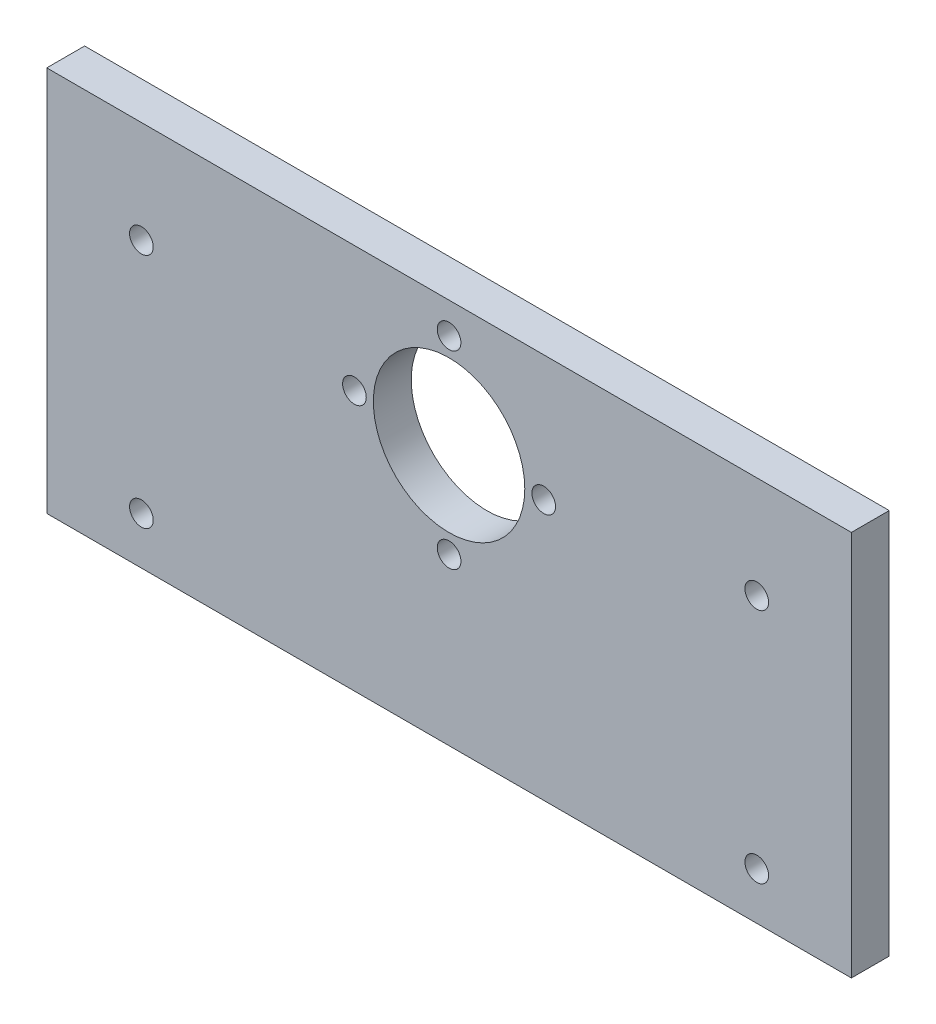
ISO-10303-21;
HEADER;
FILE_DESCRIPTION(('STEP AP214'),'2;1');
FILE_NAME('part.step','',(''),(''),'','','');
FILE_SCHEMA(('AUTOMOTIVE_DESIGN { 1 0 10303 214 1 1 1 1 }'));
ENDSEC;
DATA;
#1=APPLICATION_CONTEXT('core data for automotive mechanical design processes');
#2=APPLICATION_PROTOCOL_DEFINITION('international standard','automotive_design',2000,#1);
#3=PRODUCT_CONTEXT('',#1,'mechanical');
#4=PRODUCT('Part','Part','',(#3));
#5=PRODUCT_RELATED_PRODUCT_CATEGORY('part','',(#4));
#6=PRODUCT_DEFINITION_FORMATION('','',#4);
#7=PRODUCT_DEFINITION_CONTEXT('part definition',#1,'design');
#8=PRODUCT_DEFINITION('design','',#6,#7);
#9=PRODUCT_DEFINITION_SHAPE('','',#8);
#10=(LENGTH_UNIT() NAMED_UNIT(*) SI_UNIT(.MILLI.,.METRE.));
#11=(NAMED_UNIT(*) PLANE_ANGLE_UNIT() SI_UNIT($,.RADIAN.));
#12=(NAMED_UNIT(*) SI_UNIT($,.STERADIAN.) SOLID_ANGLE_UNIT());
#13=UNCERTAINTY_MEASURE_WITH_UNIT(LENGTH_MEASURE(1.E-05),#10,'distance_accuracy_value','');
#14=(GEOMETRIC_REPRESENTATION_CONTEXT(3) GLOBAL_UNCERTAINTY_ASSIGNED_CONTEXT((#13)) GLOBAL_UNIT_ASSIGNED_CONTEXT((#10,
#11,#12)) REPRESENTATION_CONTEXT('',''));
#15=CARTESIAN_POINT('',(0.,0.,0.));
#16=DIRECTION('',(0.,0.,1.));
#17=DIRECTION('',(1.,0.,0.));
#18=AXIS2_PLACEMENT_3D('',#15,#16,#17);
#19=CARTESIAN_POINT('',(85.0178327669924,83.3071932635603,8.));
#20=DIRECTION('',(0.,0.,-1.));
#21=DIRECTION('',(-1.,0.,0.));
#22=AXIS2_PLACEMENT_3D('',#19,#20,#21);
#23=PLANE('',#22);
#24=CARTESIAN_POINT('',(20.,0.,8.));
#25=DIRECTION('',(0.,0.,1.));
#26=DIRECTION('',(1.,0.,0.));
#27=AXIS2_PLACEMENT_3D('',#24,#25,#26);
#28=CIRCLE('',#27,2.5);
#29=CARTESIAN_POINT('',(22.5,0.,8.));
#30=VERTEX_POINT('',#29);
#31=EDGE_CURVE('E151',#30,#30,#28,.T.);
#32=ORIENTED_EDGE('',*,*,#31,.F.);
#33=EDGE_LOOP('',(#32));
#34=FACE_BOUND('',#33,.T.);
#35=CARTESIAN_POINT('',(0.,-20.,8.));
#36=DIRECTION('',(0.,0.,1.));
#37=DIRECTION('',(1.,0.,0.));
#38=AXIS2_PLACEMENT_3D('',#35,#36,#37);
#39=CIRCLE('',#38,2.5);
#40=CARTESIAN_POINT('',(2.49999999999998,-20.,8.));
#41=VERTEX_POINT('',#40);
#42=EDGE_CURVE('E145',#41,#41,#39,.T.);
#43=ORIENTED_EDGE('',*,*,#42,.F.);
#44=EDGE_LOOP('',(#43));
#45=FACE_BOUND('',#44,.T.);
#46=CARTESIAN_POINT('',(-20.,0.,8.));
#47=DIRECTION('',(0.,0.,1.));
#48=DIRECTION('',(1.,0.,0.));
#49=AXIS2_PLACEMENT_3D('',#46,#47,#48);
#50=CIRCLE('',#49,2.5);
#51=CARTESIAN_POINT('',(-17.5,0.,8.));
#52=VERTEX_POINT('',#51);
#53=EDGE_CURVE('E139',#52,#52,#50,.T.);
#54=ORIENTED_EDGE('',*,*,#53,.F.);
#55=EDGE_LOOP('',(#54));
#56=FACE_BOUND('',#55,.T.);
#57=CARTESIAN_POINT('',(0.,20.,8.));
#58=DIRECTION('',(0.,0.,1.));
#59=DIRECTION('',(1.,0.,0.));
#60=AXIS2_PLACEMENT_3D('',#57,#58,#59);
#61=CIRCLE('',#60,2.5);
#62=CARTESIAN_POINT('',(2.49999999999998,20.,8.));
#63=VERTEX_POINT('',#62);
#64=EDGE_CURVE('E133',#63,#63,#61,.T.);
#65=ORIENTED_EDGE('',*,*,#64,.F.);
#66=EDGE_LOOP('',(#65));
#67=FACE_BOUND('',#66,.T.);
#68=CARTESIAN_POINT('',(65.0178327669924,-45.,8.));
#69=DIRECTION('',(0.,0.,1.));
#70=DIRECTION('',(1.,0.,0.));
#71=AXIS2_PLACEMENT_3D('',#68,#69,#70);
#72=CIRCLE('',#71,2.5);
#73=CARTESIAN_POINT('',(67.5178327669924,-45.,8.));
#74=VERTEX_POINT('',#73);
#75=EDGE_CURVE('E127',#74,#74,#72,.T.);
#76=ORIENTED_EDGE('',*,*,#75,.F.);
#77=EDGE_LOOP('',(#76));
#78=FACE_BOUND('',#77,.T.);
#79=CARTESIAN_POINT('',(65.0178327669924,5.00000000000001,8.));
#80=DIRECTION('',(0.,0.,1.));
#81=DIRECTION('',(1.,0.,0.));
#82=AXIS2_PLACEMENT_3D('',#79,#80,#81);
#83=CIRCLE('',#82,2.5);
#84=CARTESIAN_POINT('',(67.5178327669924,5.00000000000001,8.));
#85=VERTEX_POINT('',#84);
#86=EDGE_CURVE('E121',#85,#85,#83,.T.);
#87=ORIENTED_EDGE('',*,*,#86,.F.);
#88=EDGE_LOOP('',(#87));
#89=FACE_BOUND('',#88,.T.);
#90=CARTESIAN_POINT('',(-65.0178327669924,-45.,8.));
#91=DIRECTION('',(0.,0.,1.));
#92=DIRECTION('',(1.,0.,0.));
#93=AXIS2_PLACEMENT_3D('',#90,#91,#92);
#94=CIRCLE('',#93,2.5);
#95=CARTESIAN_POINT('',(-62.5178327669924,-45.,8.));
#96=VERTEX_POINT('',#95);
#97=EDGE_CURVE('E115',#96,#96,#94,.T.);
#98=ORIENTED_EDGE('',*,*,#97,.F.);
#99=EDGE_LOOP('',(#98));
#100=FACE_BOUND('',#99,.T.);
#101=CARTESIAN_POINT('',(-65.0178327669924,4.99999999999999,8.));
#102=DIRECTION('',(0.,0.,1.));
#103=DIRECTION('',(1.,0.,0.));
#104=AXIS2_PLACEMENT_3D('',#101,#102,#103);
#105=CIRCLE('',#104,2.5);
#106=CARTESIAN_POINT('',(-62.5178327669924,4.99999999999999,8.));
#107=VERTEX_POINT('',#106);
#108=EDGE_CURVE('E109',#107,#107,#105,.T.);
#109=ORIENTED_EDGE('',*,*,#108,.F.);
#110=EDGE_LOOP('',(#109));
#111=FACE_BOUND('',#110,.T.);
#112=DIRECTION('',(0.,-1.,0.));
#113=VECTOR('',#112,1.);
#114=CARTESIAN_POINT('',(-85.0178327669924,-83.3071932635603,8.));
#115=LINE('',#114,#113);
#116=CARTESIAN_POINT('',(-85.0178327669924,26.5477243647325,8.));
#117=VERTEX_POINT('',#116);
#118=CARTESIAN_POINT('',(-85.0178327669924,-55.,8.));
#119=VERTEX_POINT('',#118);
#120=EDGE_CURVE('E11',#117,#119,#115,.T.);
#121=ORIENTED_EDGE('',*,*,#120,.T.);
#122=DIRECTION('',(-1.,0.,0.));
#123=VECTOR('',#122,1.);
#124=CARTESIAN_POINT('',(-85.0178327669924,-55.,8.));
#125=LINE('',#124,#123);
#126=CARTESIAN_POINT('',(85.0178327669924,-55.,8.));
#127=VERTEX_POINT('',#126);
#128=EDGE_CURVE('E48',#127,#119,#125,.T.);
#129=ORIENTED_EDGE('',*,*,#128,.F.);
#130=DIRECTION('',(0.,1.,0.));
#131=VECTOR('',#130,1.);
#132=CARTESIAN_POINT('',(85.0178327669924,-83.3071932635603,8.));
#133=LINE('',#132,#131);
#134=CARTESIAN_POINT('',(85.0178327669924,26.5477243647325,8.));
#135=VERTEX_POINT('',#134);
#136=EDGE_CURVE('E40',#127,#135,#133,.T.);
#137=ORIENTED_EDGE('',*,*,#136,.T.);
#138=DIRECTION('',(1.,0.,0.));
#139=VECTOR('',#138,1.);
#140=CARTESIAN_POINT('',(-85.0178327669924,26.5477243647325,8.));
#141=LINE('',#140,#139);
#142=EDGE_CURVE('E102',#117,#135,#141,.T.);
#143=ORIENTED_EDGE('',*,*,#142,.F.);
#144=EDGE_LOOP('',(#121,#129,#137,#143));
#145=FACE_BOUND('',#144,.T.);
#146=CARTESIAN_POINT('',(0.,0.,8.));
#147=DIRECTION('',(0.,0.,1.));
#148=DIRECTION('',(1.,0.,0.));
#149=AXIS2_PLACEMENT_3D('',#146,#147,#148);
#150=CIRCLE('',#149,16.);
#151=CARTESIAN_POINT('',(16.,0.,8.));
#152=VERTEX_POINT('',#151);
#153=EDGE_CURVE('E90',#152,#152,#150,.T.);
#154=ORIENTED_EDGE('',*,*,#153,.F.);
#155=EDGE_LOOP('',(#154));
#156=FACE_BOUND('',#155,.T.);
#157=ADVANCED_FACE('F31',(#34,#45,#56,#67,#78,#89,#100,#111,#145,#156),#23,.F.);
#158=CARTESIAN_POINT('',(85.0178327669924,83.3071932635603,0.));
#159=DIRECTION('',(0.,0.,-1.));
#160=DIRECTION('',(-1.,0.,0.));
#161=AXIS2_PLACEMENT_3D('',#158,#159,#160);
#162=PLANE('',#161);
#163=CARTESIAN_POINT('',(20.,0.,0.));
#164=DIRECTION('',(0.,0.,1.));
#165=DIRECTION('',(1.,0.,0.));
#166=AXIS2_PLACEMENT_3D('',#163,#164,#165);
#167=CIRCLE('',#166,2.5);
#168=CARTESIAN_POINT('',(22.5,0.,0.));
#169=VERTEX_POINT('',#168);
#170=EDGE_CURVE('E148',#169,#169,#167,.T.);
#171=ORIENTED_EDGE('',*,*,#170,.T.);
#172=EDGE_LOOP('',(#171));
#173=FACE_BOUND('',#172,.T.);
#174=CARTESIAN_POINT('',(0.,-20.,0.));
#175=DIRECTION('',(0.,0.,1.));
#176=DIRECTION('',(1.,0.,0.));
#177=AXIS2_PLACEMENT_3D('',#174,#175,#176);
#178=CIRCLE('',#177,2.5);
#179=CARTESIAN_POINT('',(2.49999999999998,-20.,0.));
#180=VERTEX_POINT('',#179);
#181=EDGE_CURVE('E142',#180,#180,#178,.T.);
#182=ORIENTED_EDGE('',*,*,#181,.T.);
#183=EDGE_LOOP('',(#182));
#184=FACE_BOUND('',#183,.T.);
#185=CARTESIAN_POINT('',(-20.,0.,0.));
#186=DIRECTION('',(0.,0.,1.));
#187=DIRECTION('',(1.,0.,0.));
#188=AXIS2_PLACEMENT_3D('',#185,#186,#187);
#189=CIRCLE('',#188,2.5);
#190=CARTESIAN_POINT('',(-17.5,0.,0.));
#191=VERTEX_POINT('',#190);
#192=EDGE_CURVE('E136',#191,#191,#189,.T.);
#193=ORIENTED_EDGE('',*,*,#192,.T.);
#194=EDGE_LOOP('',(#193));
#195=FACE_BOUND('',#194,.T.);
#196=CARTESIAN_POINT('',(0.,20.,0.));
#197=DIRECTION('',(0.,0.,1.));
#198=DIRECTION('',(1.,0.,0.));
#199=AXIS2_PLACEMENT_3D('',#196,#197,#198);
#200=CIRCLE('',#199,2.5);
#201=CARTESIAN_POINT('',(2.49999999999998,20.,0.));
#202=VERTEX_POINT('',#201);
#203=EDGE_CURVE('E130',#202,#202,#200,.T.);
#204=ORIENTED_EDGE('',*,*,#203,.T.);
#205=EDGE_LOOP('',(#204));
#206=FACE_BOUND('',#205,.T.);
#207=CARTESIAN_POINT('',(65.0178327669924,-45.,0.));
#208=DIRECTION('',(0.,0.,1.));
#209=DIRECTION('',(1.,0.,0.));
#210=AXIS2_PLACEMENT_3D('',#207,#208,#209);
#211=CIRCLE('',#210,2.5);
#212=CARTESIAN_POINT('',(67.5178327669924,-45.,0.));
#213=VERTEX_POINT('',#212);
#214=EDGE_CURVE('E124',#213,#213,#211,.T.);
#215=ORIENTED_EDGE('',*,*,#214,.T.);
#216=EDGE_LOOP('',(#215));
#217=FACE_BOUND('',#216,.T.);
#218=CARTESIAN_POINT('',(65.0178327669924,5.00000000000001,0.));
#219=DIRECTION('',(0.,0.,1.));
#220=DIRECTION('',(1.,0.,0.));
#221=AXIS2_PLACEMENT_3D('',#218,#219,#220);
#222=CIRCLE('',#221,2.5);
#223=CARTESIAN_POINT('',(67.5178327669924,5.00000000000001,0.));
#224=VERTEX_POINT('',#223);
#225=EDGE_CURVE('E118',#224,#224,#222,.T.);
#226=ORIENTED_EDGE('',*,*,#225,.T.);
#227=EDGE_LOOP('',(#226));
#228=FACE_BOUND('',#227,.T.);
#229=CARTESIAN_POINT('',(-65.0178327669924,-45.,0.));
#230=DIRECTION('',(0.,0.,1.));
#231=DIRECTION('',(1.,0.,0.));
#232=AXIS2_PLACEMENT_3D('',#229,#230,#231);
#233=CIRCLE('',#232,2.5);
#234=CARTESIAN_POINT('',(-62.5178327669924,-45.,0.));
#235=VERTEX_POINT('',#234);
#236=EDGE_CURVE('E112',#235,#235,#233,.T.);
#237=ORIENTED_EDGE('',*,*,#236,.T.);
#238=EDGE_LOOP('',(#237));
#239=FACE_BOUND('',#238,.T.);
#240=CARTESIAN_POINT('',(-65.0178327669924,4.99999999999999,0.));
#241=DIRECTION('',(0.,0.,1.));
#242=DIRECTION('',(1.,0.,0.));
#243=AXIS2_PLACEMENT_3D('',#240,#241,#242);
#244=CIRCLE('',#243,2.5);
#245=CARTESIAN_POINT('',(-62.5178327669924,4.99999999999999,0.));
#246=VERTEX_POINT('',#245);
#247=EDGE_CURVE('E107',#246,#246,#244,.T.);
#248=ORIENTED_EDGE('',*,*,#247,.T.);
#249=EDGE_LOOP('',(#248));
#250=FACE_BOUND('',#249,.T.);
#251=DIRECTION('',(-1.,0.,0.));
#252=VECTOR('',#251,1.);
#253=CARTESIAN_POINT('',(-85.0178327669924,-55.,0.));
#254=LINE('',#253,#252);
#255=CARTESIAN_POINT('',(85.0178327669924,-55.,0.));
#256=VERTEX_POINT('',#255);
#257=CARTESIAN_POINT('',(-85.0178327669924,-55.,0.));
#258=VERTEX_POINT('',#257);
#259=EDGE_CURVE('E73',#256,#258,#254,.T.);
#260=ORIENTED_EDGE('',*,*,#259,.T.);
#261=DIRECTION('',(0.,-1.,0.));
#262=VECTOR('',#261,1.);
#263=CARTESIAN_POINT('',(-85.0178327669924,-83.3071932635603,0.));
#264=LINE('',#263,#262);
#265=CARTESIAN_POINT('',(-85.0178327669924,26.5477243647325,0.));
#266=VERTEX_POINT('',#265);
#267=EDGE_CURVE('E35',#266,#258,#264,.T.);
#268=ORIENTED_EDGE('',*,*,#267,.F.);
#269=DIRECTION('',(1.,0.,0.));
#270=VECTOR('',#269,1.);
#271=CARTESIAN_POINT('',(-85.0178327669924,26.5477243647325,0.));
#272=LINE('',#271,#270);
#273=CARTESIAN_POINT('',(85.0178327669924,26.5477243647325,0.));
#274=VERTEX_POINT('',#273);
#275=EDGE_CURVE('E56',#266,#274,#272,.T.);
#276=ORIENTED_EDGE('',*,*,#275,.T.);
#277=DIRECTION('',(0.,1.,0.));
#278=VECTOR('',#277,1.);
#279=CARTESIAN_POINT('',(85.0178327669924,-83.3071932635603,0.));
#280=LINE('',#279,#278);
#281=EDGE_CURVE('E86',#256,#274,#280,.T.);
#282=ORIENTED_EDGE('',*,*,#281,.F.);
#283=EDGE_LOOP('',(#260,#268,#276,#282));
#284=FACE_BOUND('',#283,.T.);
#285=CARTESIAN_POINT('',(0.,0.,0.));
#286=DIRECTION('',(0.,0.,1.));
#287=DIRECTION('',(1.,0.,0.));
#288=AXIS2_PLACEMENT_3D('',#285,#286,#287);
#289=CIRCLE('',#288,16.);
#290=CARTESIAN_POINT('',(16.,0.,0.));
#291=VERTEX_POINT('',#290);
#292=EDGE_CURVE('E92',#291,#291,#289,.T.);
#293=ORIENTED_EDGE('',*,*,#292,.T.);
#294=EDGE_LOOP('',(#293));
#295=FACE_BOUND('',#294,.T.);
#296=ADVANCED_FACE('F88',(#173,#184,#195,#206,#217,#228,#239,#250,#284,#295),#162,.T.);
#297=CARTESIAN_POINT('',(85.0178327669924,-83.3071932635603,8.));
#298=DIRECTION('',(-1.,0.,0.));
#299=DIRECTION('',(0.,0.,1.));
#300=AXIS2_PLACEMENT_3D('',#297,#298,#299);
#301=PLANE('',#300);
#302=ORIENTED_EDGE('',*,*,#136,.F.);
#303=DIRECTION('',(0.,0.,1.));
#304=VECTOR('',#303,1.);
#305=CARTESIAN_POINT('',(85.0178327669924,-55.,0.));
#306=LINE('',#305,#304);
#307=EDGE_CURVE('E76',#256,#127,#306,.T.);
#308=ORIENTED_EDGE('',*,*,#307,.F.);
#309=ORIENTED_EDGE('',*,*,#281,.T.);
#310=DIRECTION('',(0.,0.,1.));
#311=VECTOR('',#310,1.);
#312=CARTESIAN_POINT('',(85.0178327669924,26.5477243647325,0.));
#313=LINE('',#312,#311);
#314=EDGE_CURVE('E97',#274,#135,#313,.T.);
#315=ORIENTED_EDGE('',*,*,#314,.T.);
#316=EDGE_LOOP('',(#302,#308,#309,#315));
#317=FACE_BOUND('',#316,.T.);
#318=ADVANCED_FACE('F33',(#317),#301,.F.);
#319=CARTESIAN_POINT('',(-85.0178327669924,-83.3071932635603,8.));
#320=DIRECTION('',(1.,0.,0.));
#321=DIRECTION('',(0.,0.,-1.));
#322=AXIS2_PLACEMENT_3D('',#319,#320,#321);
#323=PLANE('',#322);
#324=ORIENTED_EDGE('',*,*,#267,.T.);
#325=DIRECTION('',(0.,0.,1.));
#326=VECTOR('',#325,1.);
#327=CARTESIAN_POINT('',(-85.0178327669924,-55.,0.));
#328=LINE('',#327,#326);
#329=EDGE_CURVE('E77',#258,#119,#328,.T.);
#330=ORIENTED_EDGE('',*,*,#329,.T.);
#331=ORIENTED_EDGE('',*,*,#120,.F.);
#332=DIRECTION('',(0.,0.,1.));
#333=VECTOR('',#332,1.);
#334=CARTESIAN_POINT('',(-85.0178327669924,26.5477243647325,0.));
#335=LINE('',#334,#333);
#336=EDGE_CURVE('E99',#266,#117,#335,.T.);
#337=ORIENTED_EDGE('',*,*,#336,.F.);
#338=EDGE_LOOP('',(#324,#330,#331,#337));
#339=FACE_BOUND('',#338,.T.);
#340=ADVANCED_FACE('F192',(#339),#323,.F.);
#341=CARTESIAN_POINT('',(0.,0.,8.));
#342=DIRECTION('',(0.,0.,-1.));
#343=DIRECTION('',(-1.,0.,0.));
#344=AXIS2_PLACEMENT_3D('',#341,#342,#343);
#345=CYLINDRICAL_SURFACE('',#344,16.);
#346=ORIENTED_EDGE('',*,*,#153,.T.);
#347=EDGE_LOOP('',(#346));
#348=FACE_BOUND('',#347,.T.);
#349=ORIENTED_EDGE('',*,*,#292,.F.);
#350=EDGE_LOOP('',(#349));
#351=FACE_BOUND('',#350,.T.);
#352=ADVANCED_FACE('F188',(#348,#351),#345,.F.);
#353=CARTESIAN_POINT('',(-85.0178327669924,26.5477243647325,0.));
#354=DIRECTION('',(0.,-1.,0.));
#355=DIRECTION('',(0.,0.,-1.));
#356=AXIS2_PLACEMENT_3D('',#353,#354,#355);
#357=PLANE('',#356);
#358=ORIENTED_EDGE('',*,*,#142,.T.);
#359=ORIENTED_EDGE('',*,*,#314,.F.);
#360=ORIENTED_EDGE('',*,*,#275,.F.);
#361=ORIENTED_EDGE('',*,*,#336,.T.);
#362=EDGE_LOOP('',(#358,#359,#360,#361));
#363=FACE_BOUND('',#362,.T.);
#364=ADVANCED_FACE('F191',(#363),#357,.F.);
#365=CARTESIAN_POINT('',(-85.0178327669924,-55.,0.));
#366=DIRECTION('',(0.,1.,0.));
#367=DIRECTION('',(0.,0.,1.));
#368=AXIS2_PLACEMENT_3D('',#365,#366,#367);
#369=PLANE('',#368);
#370=ORIENTED_EDGE('',*,*,#128,.T.);
#371=ORIENTED_EDGE('',*,*,#329,.F.);
#372=ORIENTED_EDGE('',*,*,#259,.F.);
#373=ORIENTED_EDGE('',*,*,#307,.T.);
#374=EDGE_LOOP('',(#370,#371,#372,#373));
#375=FACE_BOUND('',#374,.T.);
#376=ADVANCED_FACE('F75',(#375),#369,.F.);
#377=CARTESIAN_POINT('',(-65.0178327669924,4.99999999999999,0.));
#378=DIRECTION('',(0.,0.,1.));
#379=DIRECTION('',(1.,0.,0.));
#380=AXIS2_PLACEMENT_3D('',#377,#378,#379);
#381=CYLINDRICAL_SURFACE('',#380,2.5);
#382=ORIENTED_EDGE('',*,*,#247,.F.);
#383=EDGE_LOOP('',(#382));
#384=FACE_BOUND('',#383,.T.);
#385=ORIENTED_EDGE('',*,*,#108,.T.);
#386=EDGE_LOOP('',(#385));
#387=FACE_BOUND('',#386,.T.);
#388=ADVANCED_FACE('F209',(#384,#387),#381,.F.);
#389=CARTESIAN_POINT('',(-65.0178327669924,-45.,0.));
#390=DIRECTION('',(0.,0.,1.));
#391=DIRECTION('',(1.,0.,0.));
#392=AXIS2_PLACEMENT_3D('',#389,#390,#391);
#393=CYLINDRICAL_SURFACE('',#392,2.5);
#394=ORIENTED_EDGE('',*,*,#236,.F.);
#395=EDGE_LOOP('',(#394));
#396=FACE_BOUND('',#395,.T.);
#397=ORIENTED_EDGE('',*,*,#97,.T.);
#398=EDGE_LOOP('',(#397));
#399=FACE_BOUND('',#398,.T.);
#400=ADVANCED_FACE('F214',(#396,#399),#393,.F.);
#401=CARTESIAN_POINT('',(65.0178327669924,5.00000000000001,0.));
#402=DIRECTION('',(0.,0.,1.));
#403=DIRECTION('',(1.,0.,0.));
#404=AXIS2_PLACEMENT_3D('',#401,#402,#403);
#405=CYLINDRICAL_SURFACE('',#404,2.5);
#406=ORIENTED_EDGE('',*,*,#225,.F.);
#407=EDGE_LOOP('',(#406));
#408=FACE_BOUND('',#407,.T.);
#409=ORIENTED_EDGE('',*,*,#86,.T.);
#410=EDGE_LOOP('',(#409));
#411=FACE_BOUND('',#410,.T.);
#412=ADVANCED_FACE('F218',(#408,#411),#405,.F.);
#413=CARTESIAN_POINT('',(65.0178327669924,-45.,0.));
#414=DIRECTION('',(0.,0.,1.));
#415=DIRECTION('',(1.,0.,0.));
#416=AXIS2_PLACEMENT_3D('',#413,#414,#415);
#417=CYLINDRICAL_SURFACE('',#416,2.5);
#418=ORIENTED_EDGE('',*,*,#214,.F.);
#419=EDGE_LOOP('',(#418));
#420=FACE_BOUND('',#419,.T.);
#421=ORIENTED_EDGE('',*,*,#75,.T.);
#422=EDGE_LOOP('',(#421));
#423=FACE_BOUND('',#422,.T.);
#424=ADVANCED_FACE('F222',(#420,#423),#417,.F.);
#425=CARTESIAN_POINT('',(0.,20.,0.));
#426=DIRECTION('',(0.,0.,1.));
#427=DIRECTION('',(1.,0.,0.));
#428=AXIS2_PLACEMENT_3D('',#425,#426,#427);
#429=CYLINDRICAL_SURFACE('',#428,2.5);
#430=ORIENTED_EDGE('',*,*,#203,.F.);
#431=EDGE_LOOP('',(#430));
#432=FACE_BOUND('',#431,.T.);
#433=ORIENTED_EDGE('',*,*,#64,.T.);
#434=EDGE_LOOP('',(#433));
#435=FACE_BOUND('',#434,.T.);
#436=ADVANCED_FACE('F226',(#432,#435),#429,.F.);
#437=CARTESIAN_POINT('',(-20.,0.,0.));
#438=DIRECTION('',(0.,0.,1.));
#439=DIRECTION('',(1.,0.,0.));
#440=AXIS2_PLACEMENT_3D('',#437,#438,#439);
#441=CYLINDRICAL_SURFACE('',#440,2.5);
#442=ORIENTED_EDGE('',*,*,#192,.F.);
#443=EDGE_LOOP('',(#442));
#444=FACE_BOUND('',#443,.T.);
#445=ORIENTED_EDGE('',*,*,#53,.T.);
#446=EDGE_LOOP('',(#445));
#447=FACE_BOUND('',#446,.T.);
#448=ADVANCED_FACE('F230',(#444,#447),#441,.F.);
#449=CARTESIAN_POINT('',(0.,-20.,0.));
#450=DIRECTION('',(0.,0.,1.));
#451=DIRECTION('',(1.,0.,0.));
#452=AXIS2_PLACEMENT_3D('',#449,#450,#451);
#453=CYLINDRICAL_SURFACE('',#452,2.5);
#454=ORIENTED_EDGE('',*,*,#181,.F.);
#455=EDGE_LOOP('',(#454));
#456=FACE_BOUND('',#455,.T.);
#457=ORIENTED_EDGE('',*,*,#42,.T.);
#458=EDGE_LOOP('',(#457));
#459=FACE_BOUND('',#458,.T.);
#460=ADVANCED_FACE('F162',(#456,#459),#453,.F.);
#461=CARTESIAN_POINT('',(20.,0.,0.));
#462=DIRECTION('',(0.,0.,1.));
#463=DIRECTION('',(1.,0.,0.));
#464=AXIS2_PLACEMENT_3D('',#461,#462,#463);
#465=CYLINDRICAL_SURFACE('',#464,2.5);
#466=ORIENTED_EDGE('',*,*,#170,.F.);
#467=EDGE_LOOP('',(#466));
#468=FACE_BOUND('',#467,.T.);
#469=ORIENTED_EDGE('',*,*,#31,.T.);
#470=EDGE_LOOP('',(#469));
#471=FACE_BOUND('',#470,.T.);
#472=ADVANCED_FACE('F159',(#468,#471),#465,.F.);
#473=CLOSED_SHELL('',(#157,#296,#318,#340,#352,#364,#376,#388,#400,#412,#424,#436,#448,#460,#472));
#474=MANIFOLD_SOLID_BREP('B2',#473);
#475=ADVANCED_BREP_SHAPE_REPRESENTATION('',(#18,#474),#14);
#476=SHAPE_DEFINITION_REPRESENTATION(#9,#475);
ENDSEC;
END-ISO-10303-21;
